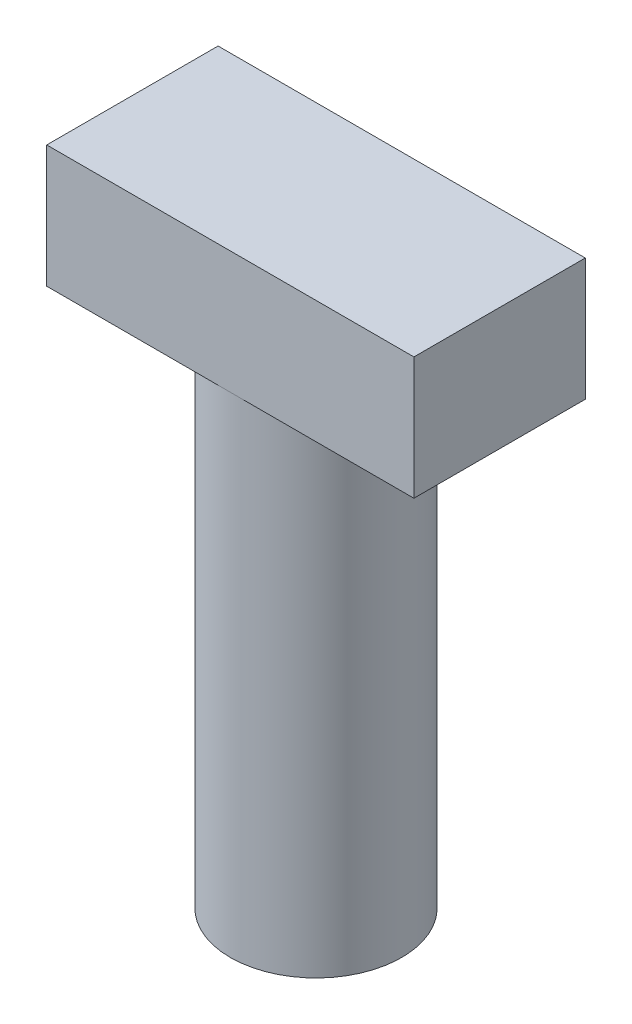
ISO-10303-21;
HEADER;
FILE_DESCRIPTION(('STEP AP214'),'2;1');
FILE_NAME('part.step','',(''),(''),'','','');
FILE_SCHEMA(('AUTOMOTIVE_DESIGN { 1 0 10303 214 1 1 1 1 }'));
ENDSEC;
DATA;
#1=APPLICATION_CONTEXT('core data for automotive mechanical design processes');
#2=APPLICATION_PROTOCOL_DEFINITION('international standard','automotive_design',2000,#1);
#3=PRODUCT_CONTEXT('',#1,'mechanical');
#4=PRODUCT('Part','Part','',(#3));
#5=PRODUCT_RELATED_PRODUCT_CATEGORY('part','',(#4));
#6=PRODUCT_DEFINITION_FORMATION('','',#4);
#7=PRODUCT_DEFINITION_CONTEXT('part definition',#1,'design');
#8=PRODUCT_DEFINITION('design','',#6,#7);
#9=PRODUCT_DEFINITION_SHAPE('','',#8);
#10=(LENGTH_UNIT() NAMED_UNIT(*) SI_UNIT(.MILLI.,.METRE.));
#11=(NAMED_UNIT(*) PLANE_ANGLE_UNIT() SI_UNIT($,.RADIAN.));
#12=(NAMED_UNIT(*) SI_UNIT($,.STERADIAN.) SOLID_ANGLE_UNIT());
#13=UNCERTAINTY_MEASURE_WITH_UNIT(LENGTH_MEASURE(1.E-05),#10,'distance_accuracy_value','');
#14=(GEOMETRIC_REPRESENTATION_CONTEXT(3) GLOBAL_UNCERTAINTY_ASSIGNED_CONTEXT((#13)) GLOBAL_UNIT_ASSIGNED_CONTEXT((#10,
#11,#12)) REPRESENTATION_CONTEXT('',''));
#15=CARTESIAN_POINT('',(0.,0.,0.));
#16=DIRECTION('',(0.,0.,1.));
#17=DIRECTION('',(1.,0.,0.));
#18=AXIS2_PLACEMENT_3D('',#15,#16,#17);
#19=CARTESIAN_POINT('',(0.,40.,0.));
#20=DIRECTION('',(0.,-1.,0.));
#21=DIRECTION('',(0.,0.,-1.));
#22=AXIS2_PLACEMENT_3D('',#19,#20,#21);
#23=CYLINDRICAL_SURFACE('',#22,7.);
#24=CARTESIAN_POINT('',(0.,40.,0.));
#25=DIRECTION('',(0.,1.,0.));
#26=DIRECTION('',(0.,0.,1.));
#27=AXIS2_PLACEMENT_3D('',#24,#25,#26);
#28=CIRCLE('',#27,7.);
#29=CARTESIAN_POINT('',(0.,40.,7.));
#30=VERTEX_POINT('',#29);
#31=CARTESIAN_POINT('',(0.,40.,-7.));
#32=VERTEX_POINT('',#31);
#33=EDGE_CURVE('E11',#30,#32,#28,.T.);
#34=ORIENTED_EDGE('',*,*,#33,.F.);
#35=EDGE_CURVE('E47',#32,#30,#28,.T.);
#36=ORIENTED_EDGE('',*,*,#35,.F.);
#37=EDGE_LOOP('',(#34,#36));
#38=FACE_BOUND('',#37,.T.);
#39=CARTESIAN_POINT('',(0.,0.,0.));
#40=DIRECTION('',(0.,1.,0.));
#41=DIRECTION('',(0.,0.,1.));
#42=AXIS2_PLACEMENT_3D('',#39,#40,#41);
#43=CIRCLE('',#42,7.);
#44=CARTESIAN_POINT('',(0.,0.,7.));
#45=VERTEX_POINT('',#44);
#46=EDGE_CURVE('E42',#45,#45,#43,.T.);
#47=ORIENTED_EDGE('',*,*,#46,.T.);
#48=EDGE_LOOP('',(#47));
#49=FACE_BOUND('',#48,.T.);
#50=ADVANCED_FACE('F39',(#38,#49),#23,.T.);
#51=CARTESIAN_POINT('',(0.,0.,0.));
#52=DIRECTION('',(0.,1.,0.));
#53=DIRECTION('',(0.,0.,1.));
#54=AXIS2_PLACEMENT_3D('',#51,#52,#53);
#55=PLANE('',#54);
#56=ORIENTED_EDGE('',*,*,#46,.F.);
#57=EDGE_LOOP('',(#56));
#58=FACE_BOUND('',#57,.T.);
#59=ADVANCED_FACE('F146',(#58),#55,.F.);
#60=CARTESIAN_POINT('',(0.,40.,0.));
#61=DIRECTION('',(0.,-1.,0.));
#62=DIRECTION('',(0.,0.,-1.));
#63=AXIS2_PLACEMENT_3D('',#60,#61,#62);
#64=PLANE('',#63);
#65=DIRECTION('',(1.,0.,0.));
#66=VECTOR('',#65,1.);
#67=CARTESIAN_POINT('',(-15.,40.,7.));
#68=LINE('',#67,#66);
#69=CARTESIAN_POINT('',(15.,40.,7.));
#70=VERTEX_POINT('',#69);
#71=EDGE_CURVE('E117',#30,#70,#68,.T.);
#72=ORIENTED_EDGE('',*,*,#71,.F.);
#73=ORIENTED_EDGE('',*,*,#33,.T.);
#74=DIRECTION('',(-1.,0.,0.));
#75=VECTOR('',#74,1.);
#76=CARTESIAN_POINT('',(-15.,40.,-7.));
#77=LINE('',#76,#75);
#78=CARTESIAN_POINT('',(15.,40.,-7.));
#79=VERTEX_POINT('',#78);
#80=EDGE_CURVE('E120',#79,#32,#77,.T.);
#81=ORIENTED_EDGE('',*,*,#80,.F.);
#82=DIRECTION('',(0.,0.,-1.));
#83=VECTOR('',#82,1.);
#84=CARTESIAN_POINT('',(15.,40.,7.));
#85=LINE('',#84,#83);
#86=EDGE_CURVE('E105',#70,#79,#85,.T.);
#87=ORIENTED_EDGE('',*,*,#86,.F.);
#88=EDGE_LOOP('',(#72,#73,#81,#87));
#89=FACE_BOUND('',#88,.T.);
#90=ADVANCED_FACE('F134',(#89),#64,.T.);
#91=CARTESIAN_POINT('',(15.,50.,7.));
#92=DIRECTION('',(-1.,0.,0.));
#93=DIRECTION('',(0.,0.,1.));
#94=AXIS2_PLACEMENT_3D('',#91,#92,#93);
#95=PLANE('',#94);
#96=ORIENTED_EDGE('',*,*,#86,.T.);
#97=DIRECTION('',(0.,-1.,0.));
#98=VECTOR('',#97,1.);
#99=CARTESIAN_POINT('',(15.,50.,-7.));
#100=LINE('',#99,#98);
#101=CARTESIAN_POINT('',(15.,50.,-7.));
#102=VERTEX_POINT('',#101);
#103=EDGE_CURVE('E85',#102,#79,#100,.T.);
#104=ORIENTED_EDGE('',*,*,#103,.F.);
#105=DIRECTION('',(0.,0.,-1.));
#106=VECTOR('',#105,1.);
#107=CARTESIAN_POINT('',(15.,50.,7.));
#108=LINE('',#107,#106);
#109=CARTESIAN_POINT('',(15.,50.,7.));
#110=VERTEX_POINT('',#109);
#111=EDGE_CURVE('E92',#110,#102,#108,.T.);
#112=ORIENTED_EDGE('',*,*,#111,.F.);
#113=DIRECTION('',(0.,-1.,0.));
#114=VECTOR('',#113,1.);
#115=CARTESIAN_POINT('',(15.,50.,7.));
#116=LINE('',#115,#114);
#117=EDGE_CURVE('E113',#110,#70,#116,.T.);
#118=ORIENTED_EDGE('',*,*,#117,.T.);
#119=EDGE_LOOP('',(#96,#104,#112,#118));
#120=FACE_BOUND('',#119,.T.);
#121=ADVANCED_FACE('F103',(#120),#95,.F.);
#122=CARTESIAN_POINT('',(-15.,50.,-7.));
#123=DIRECTION('',(0.,0.,1.));
#124=DIRECTION('',(1.,0.,0.));
#125=AXIS2_PLACEMENT_3D('',#122,#123,#124);
#126=PLANE('',#125);
#127=ORIENTED_EDGE('',*,*,#80,.T.);
#128=CARTESIAN_POINT('',(-15.,40.,-7.));
#129=VERTEX_POINT('',#128);
#130=EDGE_CURVE('E122',#32,#129,#77,.T.);
#131=ORIENTED_EDGE('',*,*,#130,.T.);
#132=DIRECTION('',(0.,-1.,0.));
#133=VECTOR('',#132,1.);
#134=CARTESIAN_POINT('',(-15.,50.,-7.));
#135=LINE('',#134,#133);
#136=CARTESIAN_POINT('',(-15.,50.,-7.));
#137=VERTEX_POINT('',#136);
#138=EDGE_CURVE('E88',#137,#129,#135,.T.);
#139=ORIENTED_EDGE('',*,*,#138,.F.);
#140=DIRECTION('',(-1.,0.,0.));
#141=VECTOR('',#140,1.);
#142=CARTESIAN_POINT('',(-15.,50.,-7.));
#143=LINE('',#142,#141);
#144=EDGE_CURVE('E80',#102,#137,#143,.T.);
#145=ORIENTED_EDGE('',*,*,#144,.F.);
#146=ORIENTED_EDGE('',*,*,#103,.T.);
#147=EDGE_LOOP('',(#127,#131,#139,#145,#146));
#148=FACE_BOUND('',#147,.T.);
#149=ADVANCED_FACE('F83',(#148),#126,.F.);
#150=CARTESIAN_POINT('',(-15.,50.,7.));
#151=DIRECTION('',(1.,0.,0.));
#152=DIRECTION('',(0.,0.,-1.));
#153=AXIS2_PLACEMENT_3D('',#150,#151,#152);
#154=PLANE('',#153);
#155=DIRECTION('',(0.,0.,1.));
#156=VECTOR('',#155,1.);
#157=CARTESIAN_POINT('',(-15.,40.,7.));
#158=LINE('',#157,#156);
#159=CARTESIAN_POINT('',(-15.,40.,7.));
#160=VERTEX_POINT('',#159);
#161=EDGE_CURVE('E118',#129,#160,#158,.T.);
#162=ORIENTED_EDGE('',*,*,#161,.T.);
#163=DIRECTION('',(0.,-1.,0.));
#164=VECTOR('',#163,1.);
#165=CARTESIAN_POINT('',(-15.,50.,7.));
#166=LINE('',#165,#164);
#167=CARTESIAN_POINT('',(-15.,50.,7.));
#168=VERTEX_POINT('',#167);
#169=EDGE_CURVE('E108',#168,#160,#166,.T.);
#170=ORIENTED_EDGE('',*,*,#169,.F.);
#171=DIRECTION('',(0.,0.,1.));
#172=VECTOR('',#171,1.);
#173=CARTESIAN_POINT('',(-15.,50.,7.));
#174=LINE('',#173,#172);
#175=EDGE_CURVE('E91',#137,#168,#174,.T.);
#176=ORIENTED_EDGE('',*,*,#175,.F.);
#177=ORIENTED_EDGE('',*,*,#138,.T.);
#178=EDGE_LOOP('',(#162,#170,#176,#177));
#179=FACE_BOUND('',#178,.T.);
#180=ADVANCED_FACE('F127',(#179),#154,.F.);
#181=CARTESIAN_POINT('',(-15.,50.,7.));
#182=DIRECTION('',(0.,0.,-1.));
#183=DIRECTION('',(-1.,0.,0.));
#184=AXIS2_PLACEMENT_3D('',#181,#182,#183);
#185=PLANE('',#184);
#186=EDGE_CURVE('E101',#160,#30,#68,.T.);
#187=ORIENTED_EDGE('',*,*,#186,.T.);
#188=ORIENTED_EDGE('',*,*,#71,.T.);
#189=ORIENTED_EDGE('',*,*,#117,.F.);
#190=DIRECTION('',(1.,0.,0.));
#191=VECTOR('',#190,1.);
#192=CARTESIAN_POINT('',(-15.,50.,7.));
#193=LINE('',#192,#191);
#194=EDGE_CURVE('E97',#168,#110,#193,.T.);
#195=ORIENTED_EDGE('',*,*,#194,.F.);
#196=ORIENTED_EDGE('',*,*,#169,.T.);
#197=EDGE_LOOP('',(#187,#188,#189,#195,#196));
#198=FACE_BOUND('',#197,.T.);
#199=ADVANCED_FACE('F131',(#198),#185,.F.);
#200=CARTESIAN_POINT('',(0.,50.,0.));
#201=DIRECTION('',(0.,-1.,0.));
#202=DIRECTION('',(0.,0.,-1.));
#203=AXIS2_PLACEMENT_3D('',#200,#201,#202);
#204=PLANE('',#203);
#205=ORIENTED_EDGE('',*,*,#111,.T.);
#206=ORIENTED_EDGE('',*,*,#144,.T.);
#207=ORIENTED_EDGE('',*,*,#175,.T.);
#208=ORIENTED_EDGE('',*,*,#194,.T.);
#209=EDGE_LOOP('',(#205,#206,#207,#208));
#210=FACE_BOUND('',#209,.T.);
#211=ADVANCED_FACE('F95',(#210),#204,.F.);
#212=ORIENTED_EDGE('',*,*,#130,.F.);
#213=ORIENTED_EDGE('',*,*,#35,.T.);
#214=ORIENTED_EDGE('',*,*,#186,.F.);
#215=ORIENTED_EDGE('',*,*,#161,.F.);
#216=EDGE_LOOP('',(#212,#213,#214,#215));
#217=FACE_BOUND('',#216,.T.);
#218=ADVANCED_FACE('F137',(#217),#64,.T.);
#219=CLOSED_SHELL('',(#50,#59,#90,#121,#149,#180,#199,#211,#218));
#220=MANIFOLD_SOLID_BREP('B2',#219);
#221=ADVANCED_BREP_SHAPE_REPRESENTATION('',(#18,#220),#14);
#222=SHAPE_DEFINITION_REPRESENTATION(#9,#221);
ENDSEC;
END-ISO-10303-21;
